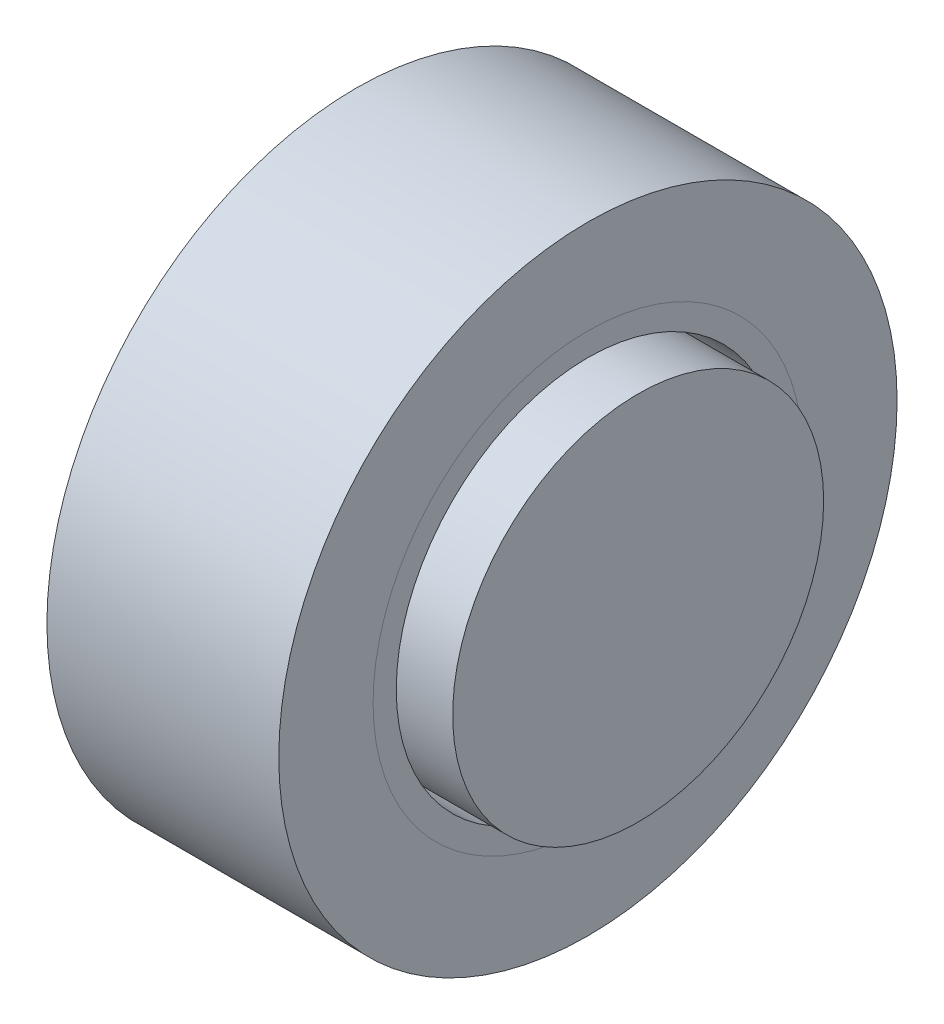
ISO-10303-21;
HEADER;
FILE_DESCRIPTION(('STEP AP214'),'2;1');
FILE_NAME('part.step','',(''),(''),'','','');
FILE_SCHEMA(('AUTOMOTIVE_DESIGN { 1 0 10303 214 1 1 1 1 }'));
ENDSEC;
DATA;
#1=APPLICATION_CONTEXT('core data for automotive mechanical design processes');
#2=APPLICATION_PROTOCOL_DEFINITION('international standard','automotive_design',2000,#1);
#3=PRODUCT_CONTEXT('',#1,'mechanical');
#4=PRODUCT('Part','Part','',(#3));
#5=PRODUCT_RELATED_PRODUCT_CATEGORY('part','',(#4));
#6=PRODUCT_DEFINITION_FORMATION('','',#4);
#7=PRODUCT_DEFINITION_CONTEXT('part definition',#1,'design');
#8=PRODUCT_DEFINITION('design','',#6,#7);
#9=PRODUCT_DEFINITION_SHAPE('','',#8);
#10=(LENGTH_UNIT() NAMED_UNIT(*) SI_UNIT(.MILLI.,.METRE.));
#11=(NAMED_UNIT(*) PLANE_ANGLE_UNIT() SI_UNIT($,.RADIAN.));
#12=(NAMED_UNIT(*) SI_UNIT($,.STERADIAN.) SOLID_ANGLE_UNIT());
#13=UNCERTAINTY_MEASURE_WITH_UNIT(LENGTH_MEASURE(1.E-05),#10,'distance_accuracy_value','');
#14=(GEOMETRIC_REPRESENTATION_CONTEXT(3) GLOBAL_UNCERTAINTY_ASSIGNED_CONTEXT((#13)) GLOBAL_UNIT_ASSIGNED_CONTEXT((#10,
#11,#12)) REPRESENTATION_CONTEXT('',''));
#15=CARTESIAN_POINT('',(0.,0.,0.));
#16=DIRECTION('',(0.,0.,1.));
#17=DIRECTION('',(1.,0.,0.));
#18=AXIS2_PLACEMENT_3D('',#15,#16,#17);
#19=CARTESIAN_POINT('',(30.,0.,0.));
#20=DIRECTION('',(1.,0.,0.));
#21=DIRECTION('',(0.,0.,-1.));
#22=AXIS2_PLACEMENT_3D('',#19,#20,#21);
#23=PLANE('',#22);
#24=CARTESIAN_POINT('',(30.,0.,0.));
#25=DIRECTION('',(1.,0.,0.));
#26=DIRECTION('',(0.,0.,-1.));
#27=AXIS2_PLACEMENT_3D('',#24,#25,#26);
#28=CIRCLE('',#27,40.);
#29=CARTESIAN_POINT('',(30.,0.,-40.));
#30=VERTEX_POINT('',#29);
#31=EDGE_CURVE('E11',#30,#30,#28,.T.);
#32=ORIENTED_EDGE('',*,*,#31,.T.);
#33=EDGE_LOOP('',(#32));
#34=FACE_BOUND('',#33,.T.);
#35=CARTESIAN_POINT('',(30.,0.,0.));
#36=DIRECTION('',(1.,0.,0.));
#37=DIRECTION('',(0.,0.,-1.));
#38=AXIS2_PLACEMENT_3D('',#35,#36,#37);
#39=CIRCLE('',#38,27.8);
#40=CARTESIAN_POINT('',(30.,0.,-27.8));
#41=VERTEX_POINT('',#40);
#42=EDGE_CURVE('E63',#41,#41,#39,.T.);
#43=ORIENTED_EDGE('',*,*,#42,.F.);
#44=EDGE_LOOP('',(#43));
#45=FACE_BOUND('',#44,.T.);
#46=ADVANCED_FACE('F52',(#34,#45),#23,.T.);
#47=CARTESIAN_POINT('',(0.,0.,0.));
#48=DIRECTION('',(1.,0.,0.));
#49=DIRECTION('',(0.,0.,-1.));
#50=AXIS2_PLACEMENT_3D('',#47,#48,#49);
#51=PLANE('',#50);
#52=CARTESIAN_POINT('',(0.,0.,0.));
#53=DIRECTION('',(1.,0.,0.));
#54=DIRECTION('',(0.,0.,-1.));
#55=AXIS2_PLACEMENT_3D('',#52,#53,#54);
#56=CIRCLE('',#55,40.);
#57=CARTESIAN_POINT('',(0.,0.,-40.));
#58=VERTEX_POINT('',#57);
#59=EDGE_CURVE('E56',#58,#58,#56,.T.);
#60=ORIENTED_EDGE('',*,*,#59,.F.);
#61=EDGE_LOOP('',(#60));
#62=FACE_BOUND('',#61,.T.);
#63=CARTESIAN_POINT('',(0.,0.,0.));
#64=DIRECTION('',(1.,0.,0.));
#65=DIRECTION('',(0.,0.,-1.));
#66=AXIS2_PLACEMENT_3D('',#63,#64,#65);
#67=CIRCLE('',#66,27.8);
#68=CARTESIAN_POINT('',(0.,0.,-27.8));
#69=VERTEX_POINT('',#68);
#70=EDGE_CURVE('E65',#69,#69,#67,.T.);
#71=ORIENTED_EDGE('',*,*,#70,.T.);
#72=EDGE_LOOP('',(#71));
#73=FACE_BOUND('',#72,.T.);
#74=ADVANCED_FACE('F75',(#62,#73),#51,.F.);
#75=CARTESIAN_POINT('',(30.,0.,0.));
#76=DIRECTION('',(-1.,0.,0.));
#77=DIRECTION('',(0.,0.,1.));
#78=AXIS2_PLACEMENT_3D('',#75,#76,#77);
#79=CYLINDRICAL_SURFACE('',#78,40.);
#80=ORIENTED_EDGE('',*,*,#31,.F.);
#81=EDGE_LOOP('',(#80));
#82=FACE_BOUND('',#81,.T.);
#83=ORIENTED_EDGE('',*,*,#59,.T.);
#84=EDGE_LOOP('',(#83));
#85=FACE_BOUND('',#84,.T.);
#86=ADVANCED_FACE('F54',(#82,#85),#79,.T.);
#87=CARTESIAN_POINT('',(30.,0.,0.));
#88=DIRECTION('',(-1.,0.,0.));
#89=DIRECTION('',(0.,0.,1.));
#90=AXIS2_PLACEMENT_3D('',#87,#88,#89);
#91=CYLINDRICAL_SURFACE('',#90,27.8);
#92=ORIENTED_EDGE('',*,*,#42,.T.);
#93=EDGE_LOOP('',(#92));
#94=FACE_BOUND('',#93,.T.);
#95=ORIENTED_EDGE('',*,*,#70,.F.);
#96=EDGE_LOOP('',(#95));
#97=FACE_BOUND('',#96,.T.);
#98=ADVANCED_FACE('F71',(#94,#97),#91,.F.);
#99=CLOSED_SHELL('',(#46,#74,#86,#98));
#100=MANIFOLD_SOLID_BREP('B2',#99);
#101=CARTESIAN_POINT('',(36.5,0.,0.));
#102=DIRECTION('',(-1.,0.,0.));
#103=DIRECTION('',(0.,0.,1.));
#104=AXIS2_PLACEMENT_3D('',#101,#102,#103);
#105=CYLINDRICAL_SURFACE('',#104,24.);
#106=CARTESIAN_POINT('',(36.5,0.,0.));
#107=DIRECTION('',(1.,0.,0.));
#108=DIRECTION('',(0.,0.,-1.));
#109=AXIS2_PLACEMENT_3D('',#106,#107,#108);
#110=CIRCLE('',#109,24.);
#111=CARTESIAN_POINT('',(36.5,0.,-24.));
#112=VERTEX_POINT('',#111);
#113=EDGE_CURVE('E51',#112,#112,#110,.T.);
#114=ORIENTED_EDGE('',*,*,#113,.F.);
#115=EDGE_LOOP('',(#114));
#116=FACE_BOUND('',#115,.T.);
#117=CARTESIAN_POINT('',(4.5,0.,0.));
#118=DIRECTION('',(1.,0.,0.));
#119=DIRECTION('',(0.,0.,-1.));
#120=AXIS2_PLACEMENT_3D('',#117,#118,#119);
#121=CIRCLE('',#120,24.);
#122=CARTESIAN_POINT('',(4.5,0.,-24.));
#123=VERTEX_POINT('',#122);
#124=EDGE_CURVE('E128',#123,#123,#121,.T.);
#125=ORIENTED_EDGE('',*,*,#124,.T.);
#126=EDGE_LOOP('',(#125));
#127=FACE_BOUND('',#126,.T.);
#128=ADVANCED_FACE('F125',(#116,#127),#105,.T.);
#129=CARTESIAN_POINT('',(36.5,0.,0.));
#130=DIRECTION('',(1.,0.,0.));
#131=DIRECTION('',(0.,0.,-1.));
#132=AXIS2_PLACEMENT_3D('',#129,#130,#131);
#133=PLANE('',#132);
#134=ORIENTED_EDGE('',*,*,#113,.T.);
#135=EDGE_LOOP('',(#134));
#136=FACE_BOUND('',#135,.T.);
#137=ADVANCED_FACE('F140',(#136),#133,.T.);
#138=CARTESIAN_POINT('',(4.5,0.,0.));
#139=DIRECTION('',(1.,0.,0.));
#140=DIRECTION('',(0.,0.,-1.));
#141=AXIS2_PLACEMENT_3D('',#138,#139,#140);
#142=PLANE('',#141);
#143=ORIENTED_EDGE('',*,*,#124,.F.);
#144=EDGE_LOOP('',(#143));
#145=FACE_BOUND('',#144,.T.);
#146=ADVANCED_FACE('F138',(#145),#142,.F.);
#147=CLOSED_SHELL('',(#128,#137,#146));
#148=MANIFOLD_SOLID_BREP('B6',#147);
#149=CARTESIAN_POINT('',(30.,0.,0.));
#150=DIRECTION('',(1.,0.,0.));
#151=DIRECTION('',(0.,0.,-1.));
#152=AXIS2_PLACEMENT_3D('',#149,#150,#151);
#153=PLANE('',#152);
#154=CARTESIAN_POINT('',(30.,0.,0.));
#155=DIRECTION('',(1.,0.,0.));
#156=DIRECTION('',(0.,0.,-1.));
#157=AXIS2_PLACEMENT_3D('',#154,#155,#156);
#158=CIRCLE('',#157,27.8);
#159=CARTESIAN_POINT('',(30.,0.,-27.8));
#160=VERTEX_POINT('',#159);
#161=EDGE_CURVE('E124',#160,#160,#158,.T.);
#162=ORIENTED_EDGE('',*,*,#161,.T.);
#163=EDGE_LOOP('',(#162));
#164=FACE_BOUND('',#163,.T.);
#165=CARTESIAN_POINT('',(30.,0.,0.));
#166=DIRECTION('',(1.,0.,0.));
#167=DIRECTION('',(0.,0.,-1.));
#168=AXIS2_PLACEMENT_3D('',#165,#166,#167);
#169=CIRCLE('',#168,24.8);
#170=CARTESIAN_POINT('',(30.,0.,-24.8));
#171=VERTEX_POINT('',#170);
#172=EDGE_CURVE('E187',#171,#171,#169,.T.);
#173=ORIENTED_EDGE('',*,*,#172,.F.);
#174=EDGE_LOOP('',(#173));
#175=FACE_BOUND('',#174,.T.);
#176=ADVANCED_FACE('F176',(#164,#175),#153,.T.);
#177=CARTESIAN_POINT('',(4.5,0.,0.));
#178=DIRECTION('',(1.,0.,0.));
#179=DIRECTION('',(0.,0.,-1.));
#180=AXIS2_PLACEMENT_3D('',#177,#178,#179);
#181=PLANE('',#180);
#182=CARTESIAN_POINT('',(4.5,0.,0.));
#183=DIRECTION('',(1.,0.,0.));
#184=DIRECTION('',(0.,0.,-1.));
#185=AXIS2_PLACEMENT_3D('',#182,#183,#184);
#186=CIRCLE('',#185,27.8);
#187=CARTESIAN_POINT('',(4.5,0.,-27.8));
#188=VERTEX_POINT('',#187);
#189=EDGE_CURVE('E180',#188,#188,#186,.T.);
#190=ORIENTED_EDGE('',*,*,#189,.F.);
#191=EDGE_LOOP('',(#190));
#192=FACE_BOUND('',#191,.T.);
#193=CARTESIAN_POINT('',(4.5,0.,0.));
#194=DIRECTION('',(1.,0.,0.));
#195=DIRECTION('',(0.,0.,-1.));
#196=AXIS2_PLACEMENT_3D('',#193,#194,#195);
#197=CIRCLE('',#196,24.8);
#198=CARTESIAN_POINT('',(4.5,0.,-24.8));
#199=VERTEX_POINT('',#198);
#200=EDGE_CURVE('E189',#199,#199,#197,.T.);
#201=ORIENTED_EDGE('',*,*,#200,.T.);
#202=EDGE_LOOP('',(#201));
#203=FACE_BOUND('',#202,.T.);
#204=ADVANCED_FACE('F199',(#192,#203),#181,.F.);
#205=CARTESIAN_POINT('',(30.,0.,0.));
#206=DIRECTION('',(-1.,0.,0.));
#207=DIRECTION('',(0.,0.,1.));
#208=AXIS2_PLACEMENT_3D('',#205,#206,#207);
#209=CYLINDRICAL_SURFACE('',#208,27.8);
#210=ORIENTED_EDGE('',*,*,#161,.F.);
#211=EDGE_LOOP('',(#210));
#212=FACE_BOUND('',#211,.T.);
#213=ORIENTED_EDGE('',*,*,#189,.T.);
#214=EDGE_LOOP('',(#213));
#215=FACE_BOUND('',#214,.T.);
#216=ADVANCED_FACE('F178',(#212,#215),#209,.T.);
#217=CARTESIAN_POINT('',(30.,0.,0.));
#218=DIRECTION('',(-1.,0.,0.));
#219=DIRECTION('',(0.,0.,1.));
#220=AXIS2_PLACEMENT_3D('',#217,#218,#219);
#221=CYLINDRICAL_SURFACE('',#220,24.8);
#222=ORIENTED_EDGE('',*,*,#172,.T.);
#223=EDGE_LOOP('',(#222));
#224=FACE_BOUND('',#223,.T.);
#225=ORIENTED_EDGE('',*,*,#200,.F.);
#226=EDGE_LOOP('',(#225));
#227=FACE_BOUND('',#226,.T.);
#228=ADVANCED_FACE('F195',(#224,#227),#221,.F.);
#229=CLOSED_SHELL('',(#176,#204,#216,#228));
#230=MANIFOLD_SOLID_BREP('B46',#229);
#231=CARTESIAN_POINT('',(4.5,0.,0.));
#232=DIRECTION('',(-1.,0.,0.));
#233=DIRECTION('',(0.,0.,1.));
#234=AXIS2_PLACEMENT_3D('',#231,#232,#233);
#235=CYLINDRICAL_SURFACE('',#234,27.8);
#236=CARTESIAN_POINT('',(4.5,0.,0.));
#237=DIRECTION('',(1.,0.,0.));
#238=DIRECTION('',(0.,0.,-1.));
#239=AXIS2_PLACEMENT_3D('',#236,#237,#238);
#240=CIRCLE('',#239,27.8);
#241=CARTESIAN_POINT('',(4.5,0.,-27.8));
#242=VERTEX_POINT('',#241);
#243=EDGE_CURVE('E175',#242,#242,#240,.T.);
#244=ORIENTED_EDGE('',*,*,#243,.F.);
#245=EDGE_LOOP('',(#244));
#246=FACE_BOUND('',#245,.T.);
#247=CARTESIAN_POINT('',(0.,0.,0.));
#248=DIRECTION('',(1.,0.,0.));
#249=DIRECTION('',(0.,0.,-1.));
#250=AXIS2_PLACEMENT_3D('',#247,#248,#249);
#251=CIRCLE('',#250,27.8);
#252=CARTESIAN_POINT('',(0.,0.,-27.8));
#253=VERTEX_POINT('',#252);
#254=EDGE_CURVE('E244',#253,#253,#251,.T.);
#255=ORIENTED_EDGE('',*,*,#254,.T.);
#256=EDGE_LOOP('',(#255));
#257=FACE_BOUND('',#256,.T.);
#258=ADVANCED_FACE('F241',(#246,#257),#235,.T.);
#259=CARTESIAN_POINT('',(4.5,0.,0.));
#260=DIRECTION('',(1.,0.,0.));
#261=DIRECTION('',(0.,0.,-1.));
#262=AXIS2_PLACEMENT_3D('',#259,#260,#261);
#263=PLANE('',#262);
#264=ORIENTED_EDGE('',*,*,#243,.T.);
#265=EDGE_LOOP('',(#264));
#266=FACE_BOUND('',#265,.T.);
#267=ADVANCED_FACE('F256',(#266),#263,.T.);
#268=CARTESIAN_POINT('',(0.,0.,0.));
#269=DIRECTION('',(1.,0.,0.));
#270=DIRECTION('',(0.,0.,-1.));
#271=AXIS2_PLACEMENT_3D('',#268,#269,#270);
#272=PLANE('',#271);
#273=ORIENTED_EDGE('',*,*,#254,.F.);
#274=EDGE_LOOP('',(#273));
#275=FACE_BOUND('',#274,.T.);
#276=ADVANCED_FACE('F254',(#275),#272,.F.);
#277=CLOSED_SHELL('',(#258,#267,#276));
#278=MANIFOLD_SOLID_BREP('B119',#277);
#279=ADVANCED_BREP_SHAPE_REPRESENTATION('',(#18,#100,#148,#230,#278),#14);
#280=SHAPE_DEFINITION_REPRESENTATION(#9,#279);
ENDSEC;
END-ISO-10303-21;
